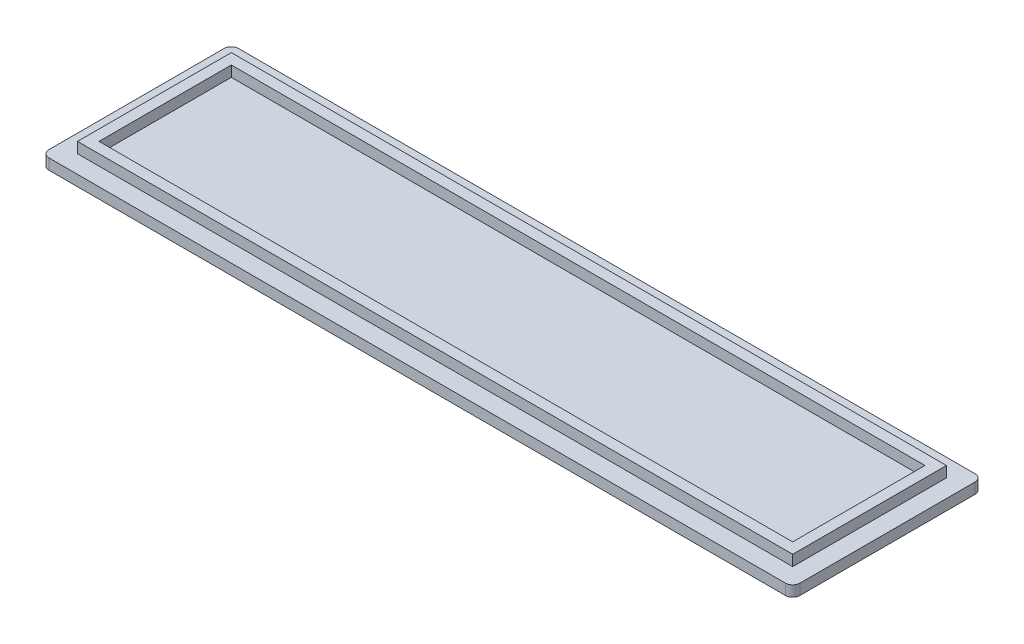
ISO-10303-21;
HEADER;
FILE_DESCRIPTION(('STEP AP214'),'2;1');
FILE_NAME('part.step','',(''),(''),'','','');
FILE_SCHEMA(('AUTOMOTIVE_DESIGN { 1 0 10303 214 1 1 1 1 }'));
ENDSEC;
DATA;
#1=APPLICATION_CONTEXT('core data for automotive mechanical design processes');
#2=APPLICATION_PROTOCOL_DEFINITION('international standard','automotive_design',2000,#1);
#3=PRODUCT_CONTEXT('',#1,'mechanical');
#4=PRODUCT('Part','Part','',(#3));
#5=PRODUCT_RELATED_PRODUCT_CATEGORY('part','',(#4));
#6=PRODUCT_DEFINITION_FORMATION('','',#4);
#7=PRODUCT_DEFINITION_CONTEXT('part definition',#1,'design');
#8=PRODUCT_DEFINITION('design','',#6,#7);
#9=PRODUCT_DEFINITION_SHAPE('','',#8);
#10=(LENGTH_UNIT() NAMED_UNIT(*) SI_UNIT(.MILLI.,.METRE.));
#11=(NAMED_UNIT(*) PLANE_ANGLE_UNIT() SI_UNIT($,.RADIAN.));
#12=(NAMED_UNIT(*) SI_UNIT($,.STERADIAN.) SOLID_ANGLE_UNIT());
#13=UNCERTAINTY_MEASURE_WITH_UNIT(LENGTH_MEASURE(1.E-05),#10,'distance_accuracy_value','');
#14=(GEOMETRIC_REPRESENTATION_CONTEXT(3) GLOBAL_UNCERTAINTY_ASSIGNED_CONTEXT((#13)) GLOBAL_UNIT_ASSIGNED_CONTEXT((#10,
#11,#12)) REPRESENTATION_CONTEXT('',''));
#15=CARTESIAN_POINT('',(0.,0.,0.));
#16=DIRECTION('',(0.,0.,1.));
#17=DIRECTION('',(1.,0.,0.));
#18=AXIS2_PLACEMENT_3D('',#15,#16,#17);
#19=CARTESIAN_POINT('',(-103.,0.,24.5));
#20=DIRECTION('',(0.,-1.,0.));
#21=DIRECTION('',(0.,0.,-1.));
#22=AXIS2_PLACEMENT_3D('',#19,#20,#21);
#23=PLANE('',#22);
#24=CARTESIAN_POINT('',(-103.,0.,24.5));
#25=DIRECTION('',(0.,-1.,0.));
#26=DIRECTION('',(0.,0.,-1.));
#27=AXIS2_PLACEMENT_3D('',#24,#25,#26);
#28=CIRCLE('',#27,2.);
#29=CARTESIAN_POINT('',(-103.,0.,26.5));
#30=VERTEX_POINT('',#29);
#31=CARTESIAN_POINT('',(-105.,0.,24.5));
#32=VERTEX_POINT('',#31);
#33=EDGE_CURVE('E361',#30,#32,#28,.T.);
#34=ORIENTED_EDGE('',*,*,#33,.F.);
#35=DIRECTION('',(-1.,0.,0.));
#36=VECTOR('',#35,1.);
#37=CARTESIAN_POINT('',(103.,0.,26.5));
#38=LINE('',#37,#36);
#39=CARTESIAN_POINT('',(103.,0.,26.5));
#40=VERTEX_POINT('',#39);
#41=EDGE_CURVE('E366',#40,#30,#38,.T.);
#42=ORIENTED_EDGE('',*,*,#41,.F.);
#43=CARTESIAN_POINT('',(103.,0.,24.5));
#44=DIRECTION('',(0.,-1.,0.));
#45=DIRECTION('',(0.,0.,-1.));
#46=AXIS2_PLACEMENT_3D('',#43,#44,#45);
#47=CIRCLE('',#46,2.);
#48=CARTESIAN_POINT('',(105.,0.,24.5));
#49=VERTEX_POINT('',#48);
#50=EDGE_CURVE('E393',#49,#40,#47,.T.);
#51=ORIENTED_EDGE('',*,*,#50,.F.);
#52=DIRECTION('',(0.,0.,1.));
#53=VECTOR('',#52,1.);
#54=CARTESIAN_POINT('',(105.,0.,-24.5));
#55=LINE('',#54,#53);
#56=CARTESIAN_POINT('',(105.,0.,-24.5));
#57=VERTEX_POINT('',#56);
#58=EDGE_CURVE('E391',#57,#49,#55,.T.);
#59=ORIENTED_EDGE('',*,*,#58,.F.);
#60=CARTESIAN_POINT('',(103.,0.,-24.5));
#61=DIRECTION('',(0.,-1.,0.));
#62=DIRECTION('',(0.,0.,-1.));
#63=AXIS2_PLACEMENT_3D('',#60,#61,#62);
#64=CIRCLE('',#63,2.);
#65=CARTESIAN_POINT('',(103.,0.,-26.5));
#66=VERTEX_POINT('',#65);
#67=EDGE_CURVE('E389',#66,#57,#64,.T.);
#68=ORIENTED_EDGE('',*,*,#67,.F.);
#69=DIRECTION('',(1.,0.,0.));
#70=VECTOR('',#69,1.);
#71=CARTESIAN_POINT('',(-103.,0.,-26.5));
#72=LINE('',#71,#70);
#73=CARTESIAN_POINT('',(-103.,0.,-26.5));
#74=VERTEX_POINT('',#73);
#75=EDGE_CURVE('E387',#74,#66,#72,.T.);
#76=ORIENTED_EDGE('',*,*,#75,.F.);
#77=CARTESIAN_POINT('',(-103.,0.,-24.5));
#78=DIRECTION('',(0.,-1.,0.));
#79=DIRECTION('',(0.,0.,-1.));
#80=AXIS2_PLACEMENT_3D('',#77,#78,#79);
#81=CIRCLE('',#80,2.);
#82=CARTESIAN_POINT('',(-105.,0.,-24.5));
#83=VERTEX_POINT('',#82);
#84=EDGE_CURVE('E385',#83,#74,#81,.T.);
#85=ORIENTED_EDGE('',*,*,#84,.F.);
#86=DIRECTION('',(0.,0.,-1.));
#87=VECTOR('',#86,1.);
#88=CARTESIAN_POINT('',(-105.,0.,24.5));
#89=LINE('',#88,#87);
#90=EDGE_CURVE('E383',#32,#83,#89,.T.);
#91=ORIENTED_EDGE('',*,*,#90,.F.);
#92=EDGE_LOOP('',(#34,#42,#51,#59,#68,#76,#85,#91));
#93=FACE_BOUND('',#92,.T.);
#94=DIRECTION('',(-1.,0.,0.));
#95=VECTOR('',#94,1.);
#96=CARTESIAN_POINT('',(-103.,0.,-21.5));
#97=LINE('',#96,#95);
#98=CARTESIAN_POINT('',(100.,0.,-21.5));
#99=VERTEX_POINT('',#98);
#100=CARTESIAN_POINT('',(-100.,0.,-21.5));
#101=VERTEX_POINT('',#100);
#102=EDGE_CURVE('E328',#99,#101,#97,.T.);
#103=ORIENTED_EDGE('',*,*,#102,.F.);
#104=DIRECTION('',(0.,0.,-1.));
#105=VECTOR('',#104,1.);
#106=CARTESIAN_POINT('',(100.,0.,24.5));
#107=LINE('',#106,#105);
#108=CARTESIAN_POINT('',(100.,0.,21.5));
#109=VERTEX_POINT('',#108);
#110=EDGE_CURVE('E333',#109,#99,#107,.T.);
#111=ORIENTED_EDGE('',*,*,#110,.F.);
#112=DIRECTION('',(1.,0.,0.));
#113=VECTOR('',#112,1.);
#114=CARTESIAN_POINT('',(-103.,0.,21.5));
#115=LINE('',#114,#113);
#116=CARTESIAN_POINT('',(-100.,0.,21.5));
#117=VERTEX_POINT('',#116);
#118=EDGE_CURVE('E345',#117,#109,#115,.T.);
#119=ORIENTED_EDGE('',*,*,#118,.F.);
#120=DIRECTION('',(0.,0.,1.));
#121=VECTOR('',#120,1.);
#122=CARTESIAN_POINT('',(-100.,0.,24.5));
#123=LINE('',#122,#121);
#124=EDGE_CURVE('E342',#101,#117,#123,.T.);
#125=ORIENTED_EDGE('',*,*,#124,.F.);
#126=EDGE_LOOP('',(#103,#111,#119,#125));
#127=FACE_BOUND('',#126,.T.);
#128=ADVANCED_FACE('F68',(#93,#127),#23,.F.);
#129=CARTESIAN_POINT('',(-103.,-3.,24.5));
#130=DIRECTION('',(0.,1.,0.));
#131=DIRECTION('',(0.,0.,1.));
#132=AXIS2_PLACEMENT_3D('',#129,#130,#131);
#133=CYLINDRICAL_SURFACE('',#132,2.);
#134=ORIENTED_EDGE('',*,*,#33,.T.);
#135=DIRECTION('',(0.,1.,0.));
#136=VECTOR('',#135,1.);
#137=CARTESIAN_POINT('',(-105.,-3.,24.5));
#138=LINE('',#137,#136);
#139=CARTESIAN_POINT('',(-105.,-3.,24.5));
#140=VERTEX_POINT('',#139);
#141=EDGE_CURVE('E12',#140,#32,#138,.T.);
#142=ORIENTED_EDGE('',*,*,#141,.F.);
#143=CARTESIAN_POINT('',(-103.,-3.,24.5));
#144=DIRECTION('',(0.,-1.,0.));
#145=DIRECTION('',(0.,0.,-1.));
#146=AXIS2_PLACEMENT_3D('',#143,#144,#145);
#147=CIRCLE('',#146,2.);
#148=CARTESIAN_POINT('',(-103.,-3.,26.5));
#149=VERTEX_POINT('',#148);
#150=EDGE_CURVE('E362',#149,#140,#147,.T.);
#151=ORIENTED_EDGE('',*,*,#150,.F.);
#152=DIRECTION('',(0.,1.,0.));
#153=VECTOR('',#152,1.);
#154=CARTESIAN_POINT('',(-103.,-3.,26.5));
#155=LINE('',#154,#153);
#156=EDGE_CURVE('E380',#149,#30,#155,.T.);
#157=ORIENTED_EDGE('',*,*,#156,.T.);
#158=EDGE_LOOP('',(#134,#142,#151,#157));
#159=FACE_BOUND('',#158,.T.);
#160=ADVANCED_FACE('F70',(#159),#133,.T.);
#161=CARTESIAN_POINT('',(-105.,-3.,24.5));
#162=DIRECTION('',(1.,0.,0.));
#163=DIRECTION('',(0.,0.,-1.));
#164=AXIS2_PLACEMENT_3D('',#161,#162,#163);
#165=PLANE('',#164);
#166=ORIENTED_EDGE('',*,*,#90,.T.);
#167=DIRECTION('',(0.,1.,0.));
#168=VECTOR('',#167,1.);
#169=CARTESIAN_POINT('',(-105.,-3.,-24.5));
#170=LINE('',#169,#168);
#171=CARTESIAN_POINT('',(-105.,-3.,-24.5));
#172=VERTEX_POINT('',#171);
#173=EDGE_CURVE('E76',#172,#83,#170,.T.);
#174=ORIENTED_EDGE('',*,*,#173,.F.);
#175=DIRECTION('',(0.,0.,-1.));
#176=VECTOR('',#175,1.);
#177=CARTESIAN_POINT('',(-105.,-3.,24.5));
#178=LINE('',#177,#176);
#179=EDGE_CURVE('E365',#140,#172,#178,.T.);
#180=ORIENTED_EDGE('',*,*,#179,.F.);
#181=ORIENTED_EDGE('',*,*,#141,.T.);
#182=EDGE_LOOP('',(#166,#174,#180,#181));
#183=FACE_BOUND('',#182,.T.);
#184=ADVANCED_FACE('F440',(#183),#165,.F.);
#185=CARTESIAN_POINT('',(-103.,-3.,-24.5));
#186=DIRECTION('',(0.,1.,0.));
#187=DIRECTION('',(0.,0.,1.));
#188=AXIS2_PLACEMENT_3D('',#185,#186,#187);
#189=CYLINDRICAL_SURFACE('',#188,2.);
#190=ORIENTED_EDGE('',*,*,#84,.T.);
#191=DIRECTION('',(0.,1.,0.));
#192=VECTOR('',#191,1.);
#193=CARTESIAN_POINT('',(-103.,-3.,-26.5));
#194=LINE('',#193,#192);
#195=CARTESIAN_POINT('',(-103.,-3.,-26.5));
#196=VERTEX_POINT('',#195);
#197=EDGE_CURVE('E410',#196,#74,#194,.T.);
#198=ORIENTED_EDGE('',*,*,#197,.F.);
#199=CARTESIAN_POINT('',(-103.,-3.,-24.5));
#200=DIRECTION('',(0.,-1.,0.));
#201=DIRECTION('',(0.,0.,-1.));
#202=AXIS2_PLACEMENT_3D('',#199,#200,#201);
#203=CIRCLE('',#202,2.);
#204=EDGE_CURVE('E368',#172,#196,#203,.T.);
#205=ORIENTED_EDGE('',*,*,#204,.F.);
#206=ORIENTED_EDGE('',*,*,#173,.T.);
#207=EDGE_LOOP('',(#190,#198,#205,#206));
#208=FACE_BOUND('',#207,.T.);
#209=ADVANCED_FACE('F417',(#208),#189,.T.);
#210=CARTESIAN_POINT('',(-103.,-3.,-26.5));
#211=DIRECTION('',(0.,0.,1.));
#212=DIRECTION('',(1.,0.,0.));
#213=AXIS2_PLACEMENT_3D('',#210,#211,#212);
#214=PLANE('',#213);
#215=ORIENTED_EDGE('',*,*,#75,.T.);
#216=DIRECTION('',(0.,1.,0.));
#217=VECTOR('',#216,1.);
#218=CARTESIAN_POINT('',(103.,-3.,-26.5));
#219=LINE('',#218,#217);
#220=CARTESIAN_POINT('',(103.,-3.,-26.5));
#221=VERTEX_POINT('',#220);
#222=EDGE_CURVE('E407',#221,#66,#219,.T.);
#223=ORIENTED_EDGE('',*,*,#222,.F.);
#224=DIRECTION('',(1.,0.,0.));
#225=VECTOR('',#224,1.);
#226=CARTESIAN_POINT('',(-103.,-3.,-26.5));
#227=LINE('',#226,#225);
#228=EDGE_CURVE('E370',#196,#221,#227,.T.);
#229=ORIENTED_EDGE('',*,*,#228,.F.);
#230=ORIENTED_EDGE('',*,*,#197,.T.);
#231=EDGE_LOOP('',(#215,#223,#229,#230));
#232=FACE_BOUND('',#231,.T.);
#233=ADVANCED_FACE('F428',(#232),#214,.F.);
#234=CARTESIAN_POINT('',(103.,-3.,-24.5));
#235=DIRECTION('',(0.,1.,0.));
#236=DIRECTION('',(0.,0.,1.));
#237=AXIS2_PLACEMENT_3D('',#234,#235,#236);
#238=CYLINDRICAL_SURFACE('',#237,2.);
#239=ORIENTED_EDGE('',*,*,#67,.T.);
#240=DIRECTION('',(0.,1.,0.));
#241=VECTOR('',#240,1.);
#242=CARTESIAN_POINT('',(105.,-3.,-24.5));
#243=LINE('',#242,#241);
#244=CARTESIAN_POINT('',(105.,-3.,-24.5));
#245=VERTEX_POINT('',#244);
#246=EDGE_CURVE('E404',#245,#57,#243,.T.);
#247=ORIENTED_EDGE('',*,*,#246,.F.);
#248=CARTESIAN_POINT('',(103.,-3.,-24.5));
#249=DIRECTION('',(0.,-1.,0.));
#250=DIRECTION('',(0.,0.,-1.));
#251=AXIS2_PLACEMENT_3D('',#248,#249,#250);
#252=CIRCLE('',#251,2.);
#253=EDGE_CURVE('E372',#221,#245,#252,.T.);
#254=ORIENTED_EDGE('',*,*,#253,.F.);
#255=ORIENTED_EDGE('',*,*,#222,.T.);
#256=EDGE_LOOP('',(#239,#247,#254,#255));
#257=FACE_BOUND('',#256,.T.);
#258=ADVANCED_FACE('F432',(#257),#238,.T.);
#259=CARTESIAN_POINT('',(105.,-3.,-24.5));
#260=DIRECTION('',(-1.,0.,0.));
#261=DIRECTION('',(0.,0.,1.));
#262=AXIS2_PLACEMENT_3D('',#259,#260,#261);
#263=PLANE('',#262);
#264=ORIENTED_EDGE('',*,*,#58,.T.);
#265=DIRECTION('',(0.,1.,0.));
#266=VECTOR('',#265,1.);
#267=CARTESIAN_POINT('',(105.,-3.,24.5));
#268=LINE('',#267,#266);
#269=CARTESIAN_POINT('',(105.,-3.,24.5));
#270=VERTEX_POINT('',#269);
#271=EDGE_CURVE('E401',#270,#49,#268,.T.);
#272=ORIENTED_EDGE('',*,*,#271,.F.);
#273=DIRECTION('',(0.,0.,1.));
#274=VECTOR('',#273,1.);
#275=CARTESIAN_POINT('',(105.,-3.,-24.5));
#276=LINE('',#275,#274);
#277=EDGE_CURVE('E374',#245,#270,#276,.T.);
#278=ORIENTED_EDGE('',*,*,#277,.F.);
#279=ORIENTED_EDGE('',*,*,#246,.T.);
#280=EDGE_LOOP('',(#264,#272,#278,#279));
#281=FACE_BOUND('',#280,.T.);
#282=ADVANCED_FACE('F453',(#281),#263,.F.);
#283=CARTESIAN_POINT('',(103.,-3.,24.5));
#284=DIRECTION('',(0.,1.,0.));
#285=DIRECTION('',(0.,0.,1.));
#286=AXIS2_PLACEMENT_3D('',#283,#284,#285);
#287=CYLINDRICAL_SURFACE('',#286,2.);
#288=ORIENTED_EDGE('',*,*,#50,.T.);
#289=DIRECTION('',(0.,1.,0.));
#290=VECTOR('',#289,1.);
#291=CARTESIAN_POINT('',(103.,-3.,26.5));
#292=LINE('',#291,#290);
#293=CARTESIAN_POINT('',(103.,-3.,26.5));
#294=VERTEX_POINT('',#293);
#295=EDGE_CURVE('E398',#294,#40,#292,.T.);
#296=ORIENTED_EDGE('',*,*,#295,.F.);
#297=CARTESIAN_POINT('',(103.,-3.,24.5));
#298=DIRECTION('',(0.,-1.,0.));
#299=DIRECTION('',(0.,0.,-1.));
#300=AXIS2_PLACEMENT_3D('',#297,#298,#299);
#301=CIRCLE('',#300,2.);
#302=EDGE_CURVE('E376',#270,#294,#301,.T.);
#303=ORIENTED_EDGE('',*,*,#302,.F.);
#304=ORIENTED_EDGE('',*,*,#271,.T.);
#305=EDGE_LOOP('',(#288,#296,#303,#304));
#306=FACE_BOUND('',#305,.T.);
#307=ADVANCED_FACE('F451',(#306),#287,.T.);
#308=CARTESIAN_POINT('',(103.,-3.,26.5));
#309=DIRECTION('',(0.,0.,-1.));
#310=DIRECTION('',(-1.,0.,0.));
#311=AXIS2_PLACEMENT_3D('',#308,#309,#310);
#312=PLANE('',#311);
#313=ORIENTED_EDGE('',*,*,#41,.T.);
#314=ORIENTED_EDGE('',*,*,#156,.F.);
#315=DIRECTION('',(-1.,0.,0.));
#316=VECTOR('',#315,1.);
#317=CARTESIAN_POINT('',(103.,-3.,26.5));
#318=LINE('',#317,#316);
#319=EDGE_CURVE('E378',#294,#149,#318,.T.);
#320=ORIENTED_EDGE('',*,*,#319,.F.);
#321=ORIENTED_EDGE('',*,*,#295,.T.);
#322=EDGE_LOOP('',(#313,#314,#320,#321));
#323=FACE_BOUND('',#322,.T.);
#324=ADVANCED_FACE('F446',(#323),#312,.F.);
#325=CARTESIAN_POINT('',(-103.,-3.,24.5));
#326=DIRECTION('',(0.,-1.,0.));
#327=DIRECTION('',(0.,0.,-1.));
#328=AXIS2_PLACEMENT_3D('',#325,#326,#327);
#329=PLANE('',#328);
#330=DIRECTION('',(0.,0.,1.));
#331=VECTOR('',#330,1.);
#332=CARTESIAN_POINT('',(12.55,-3.,15.8));
#333=LINE('',#332,#331);
#334=CARTESIAN_POINT('',(12.55,-3.,15.8));
#335=VERTEX_POINT('',#334);
#336=CARTESIAN_POINT('',(12.55,-3.,18.));
#337=VERTEX_POINT('',#336);
#338=EDGE_CURVE('E83',#335,#337,#333,.T.);
#339=ORIENTED_EDGE('',*,*,#338,.F.);
#340=DIRECTION('',(1.,0.,0.));
#341=VECTOR('',#340,1.);
#342=CARTESIAN_POINT('',(8.45000000000001,-3.,15.8));
#343=LINE('',#342,#341);
#344=CARTESIAN_POINT('',(8.45000000000001,-3.,15.8));
#345=VERTEX_POINT('',#344);
#346=EDGE_CURVE('E250',#345,#335,#343,.T.);
#347=ORIENTED_EDGE('',*,*,#346,.F.);
#348=DIRECTION('',(0.,0.,-1.));
#349=VECTOR('',#348,1.);
#350=CARTESIAN_POINT('',(8.45000000000001,-3.,15.8));
#351=LINE('',#350,#349);
#352=CARTESIAN_POINT('',(8.45000000000001,-3.,18.));
#353=VERTEX_POINT('',#352);
#354=EDGE_CURVE('E253',#353,#345,#351,.T.);
#355=ORIENTED_EDGE('',*,*,#354,.F.);
#356=DIRECTION('',(-1.,0.,0.));
#357=VECTOR('',#356,1.);
#358=CARTESIAN_POINT('',(8.45000000000001,-3.,18.));
#359=LINE('',#358,#357);
#360=EDGE_CURVE('E259',#337,#353,#359,.T.);
#361=ORIENTED_EDGE('',*,*,#360,.F.);
#362=EDGE_LOOP('',(#339,#347,#355,#361));
#363=FACE_BOUND('',#362,.T.);
#364=DIRECTION('',(0.,0.,1.));
#365=VECTOR('',#364,1.);
#366=CARTESIAN_POINT('',(20.55,-3.,15.8));
#367=LINE('',#366,#365);
#368=CARTESIAN_POINT('',(20.55,-3.,15.8));
#369=VERTEX_POINT('',#368);
#370=CARTESIAN_POINT('',(20.55,-3.,18.));
#371=VERTEX_POINT('',#370);
#372=EDGE_CURVE('E91',#369,#371,#367,.T.);
#373=ORIENTED_EDGE('',*,*,#372,.F.);
#374=DIRECTION('',(1.,0.,0.));
#375=VECTOR('',#374,1.);
#376=CARTESIAN_POINT('',(20.55,-3.,15.8));
#377=LINE('',#376,#375);
#378=CARTESIAN_POINT('',(16.45,-3.,15.8));
#379=VERTEX_POINT('',#378);
#380=EDGE_CURVE('E278',#379,#369,#377,.T.);
#381=ORIENTED_EDGE('',*,*,#380,.F.);
#382=DIRECTION('',(0.,0.,-1.));
#383=VECTOR('',#382,1.);
#384=CARTESIAN_POINT('',(16.45,-3.,15.8));
#385=LINE('',#384,#383);
#386=CARTESIAN_POINT('',(16.45,-3.,18.));
#387=VERTEX_POINT('',#386);
#388=EDGE_CURVE('E281',#387,#379,#385,.T.);
#389=ORIENTED_EDGE('',*,*,#388,.F.);
#390=DIRECTION('',(-1.,0.,0.));
#391=VECTOR('',#390,1.);
#392=CARTESIAN_POINT('',(20.55,-3.,18.));
#393=LINE('',#392,#391);
#394=EDGE_CURVE('E285',#371,#387,#393,.T.);
#395=ORIENTED_EDGE('',*,*,#394,.F.);
#396=EDGE_LOOP('',(#373,#381,#389,#395));
#397=FACE_BOUND('',#396,.T.);
#398=ORIENTED_EDGE('',*,*,#150,.T.);
#399=ORIENTED_EDGE('',*,*,#179,.T.);
#400=ORIENTED_EDGE('',*,*,#204,.T.);
#401=ORIENTED_EDGE('',*,*,#228,.T.);
#402=ORIENTED_EDGE('',*,*,#253,.T.);
#403=ORIENTED_EDGE('',*,*,#277,.T.);
#404=ORIENTED_EDGE('',*,*,#302,.T.);
#405=ORIENTED_EDGE('',*,*,#319,.T.);
#406=EDGE_LOOP('',(#398,#399,#400,#401,#402,#403,#404,#405));
#407=FACE_BOUND('',#406,.T.);
#408=ADVANCED_FACE('F436',(#363,#397,#407),#329,.T.);
#409=CARTESIAN_POINT('',(0.,3.,0.));
#410=DIRECTION('',(0.,1.,0.));
#411=DIRECTION('',(0.,0.,1.));
#412=AXIS2_PLACEMENT_3D('',#409,#410,#411);
#413=PLANE('',#412);
#414=DIRECTION('',(-1.,0.,0.));
#415=VECTOR('',#414,1.);
#416=CARTESIAN_POINT('',(-103.,3.,-21.5));
#417=LINE('',#416,#415);
#418=CARTESIAN_POINT('',(100.,3.,-21.5));
#419=VERTEX_POINT('',#418);
#420=CARTESIAN_POINT('',(-100.,3.,-21.5));
#421=VERTEX_POINT('',#420);
#422=EDGE_CURVE('E329',#419,#421,#417,.T.);
#423=ORIENTED_EDGE('',*,*,#422,.T.);
#424=DIRECTION('',(0.,0.,1.));
#425=VECTOR('',#424,1.);
#426=CARTESIAN_POINT('',(-100.,3.,24.5));
#427=LINE('',#426,#425);
#428=CARTESIAN_POINT('',(-100.,3.,21.5));
#429=VERTEX_POINT('',#428);
#430=EDGE_CURVE('E332',#421,#429,#427,.T.);
#431=ORIENTED_EDGE('',*,*,#430,.T.);
#432=DIRECTION('',(1.,0.,0.));
#433=VECTOR('',#432,1.);
#434=CARTESIAN_POINT('',(-103.,3.,21.5));
#435=LINE('',#434,#433);
#436=CARTESIAN_POINT('',(100.,3.,21.5));
#437=VERTEX_POINT('',#436);
#438=EDGE_CURVE('E335',#429,#437,#435,.T.);
#439=ORIENTED_EDGE('',*,*,#438,.T.);
#440=DIRECTION('',(0.,0.,-1.));
#441=VECTOR('',#440,1.);
#442=CARTESIAN_POINT('',(100.,3.,24.5));
#443=LINE('',#442,#441);
#444=EDGE_CURVE('E337',#437,#419,#443,.T.);
#445=ORIENTED_EDGE('',*,*,#444,.T.);
#446=EDGE_LOOP('',(#423,#431,#439,#445));
#447=FACE_BOUND('',#446,.T.);
#448=DIRECTION('',(0.,0.,1.));
#449=VECTOR('',#448,1.);
#450=CARTESIAN_POINT('',(-97.,3.,24.5));
#451=LINE('',#450,#449);
#452=CARTESIAN_POINT('',(-97.,3.,-18.5));
#453=VERTEX_POINT('',#452);
#454=CARTESIAN_POINT('',(-97.,3.,18.5));
#455=VERTEX_POINT('',#454);
#456=EDGE_CURVE('E301',#453,#455,#451,.T.);
#457=ORIENTED_EDGE('',*,*,#456,.F.);
#458=DIRECTION('',(-1.,0.,0.));
#459=VECTOR('',#458,1.);
#460=CARTESIAN_POINT('',(-103.,3.,-18.5));
#461=LINE('',#460,#459);
#462=CARTESIAN_POINT('',(97.,3.,-18.5));
#463=VERTEX_POINT('',#462);
#464=EDGE_CURVE('E299',#463,#453,#461,.T.);
#465=ORIENTED_EDGE('',*,*,#464,.F.);
#466=DIRECTION('',(0.,0.,-1.));
#467=VECTOR('',#466,1.);
#468=CARTESIAN_POINT('',(97.,3.,24.5));
#469=LINE('',#468,#467);
#470=CARTESIAN_POINT('',(97.,3.,18.5));
#471=VERTEX_POINT('',#470);
#472=EDGE_CURVE('E307',#471,#463,#469,.T.);
#473=ORIENTED_EDGE('',*,*,#472,.F.);
#474=DIRECTION('',(1.,0.,0.));
#475=VECTOR('',#474,1.);
#476=CARTESIAN_POINT('',(-103.,3.,18.5));
#477=LINE('',#476,#475);
#478=EDGE_CURVE('E304',#455,#471,#477,.T.);
#479=ORIENTED_EDGE('',*,*,#478,.F.);
#480=EDGE_LOOP('',(#457,#465,#473,#479));
#481=FACE_BOUND('',#480,.T.);
#482=ADVANCED_FACE('F502',(#447,#481),#413,.T.);
#483=CARTESIAN_POINT('',(-103.,3.,-21.5));
#484=DIRECTION('',(0.,0.,1.));
#485=DIRECTION('',(1.,0.,0.));
#486=AXIS2_PLACEMENT_3D('',#483,#484,#485);
#487=PLANE('',#486);
#488=ORIENTED_EDGE('',*,*,#102,.T.);
#489=DIRECTION('',(0.,-1.,0.));
#490=VECTOR('',#489,1.);
#491=CARTESIAN_POINT('',(-100.,3.,-21.5));
#492=LINE('',#491,#490);
#493=EDGE_CURVE('E358',#421,#101,#492,.T.);
#494=ORIENTED_EDGE('',*,*,#493,.F.);
#495=ORIENTED_EDGE('',*,*,#422,.F.);
#496=DIRECTION('',(0.,-1.,0.));
#497=VECTOR('',#496,1.);
#498=CARTESIAN_POINT('',(100.,3.,-21.5));
#499=LINE('',#498,#497);
#500=EDGE_CURVE('E339',#419,#99,#499,.T.);
#501=ORIENTED_EDGE('',*,*,#500,.T.);
#502=EDGE_LOOP('',(#488,#494,#495,#501));
#503=FACE_BOUND('',#502,.T.);
#504=ADVANCED_FACE('F504',(#503),#487,.F.);
#505=CARTESIAN_POINT('',(-100.,3.,24.5));
#506=DIRECTION('',(1.,0.,0.));
#507=DIRECTION('',(0.,0.,-1.));
#508=AXIS2_PLACEMENT_3D('',#505,#506,#507);
#509=PLANE('',#508);
#510=ORIENTED_EDGE('',*,*,#124,.T.);
#511=DIRECTION('',(0.,-1.,0.));
#512=VECTOR('',#511,1.);
#513=CARTESIAN_POINT('',(-100.,3.,21.5));
#514=LINE('',#513,#512);
#515=EDGE_CURVE('E355',#429,#117,#514,.T.);
#516=ORIENTED_EDGE('',*,*,#515,.F.);
#517=ORIENTED_EDGE('',*,*,#430,.F.);
#518=ORIENTED_EDGE('',*,*,#493,.T.);
#519=EDGE_LOOP('',(#510,#516,#517,#518));
#520=FACE_BOUND('',#519,.T.);
#521=ADVANCED_FACE('F512',(#520),#509,.F.);
#522=CARTESIAN_POINT('',(-103.,3.,21.5));
#523=DIRECTION('',(0.,0.,-1.));
#524=DIRECTION('',(-1.,0.,0.));
#525=AXIS2_PLACEMENT_3D('',#522,#523,#524);
#526=PLANE('',#525);
#527=ORIENTED_EDGE('',*,*,#118,.T.);
#528=DIRECTION('',(0.,-1.,0.));
#529=VECTOR('',#528,1.);
#530=CARTESIAN_POINT('',(100.,3.,21.5));
#531=LINE('',#530,#529);
#532=EDGE_CURVE('E352',#437,#109,#531,.T.);
#533=ORIENTED_EDGE('',*,*,#532,.F.);
#534=ORIENTED_EDGE('',*,*,#438,.F.);
#535=ORIENTED_EDGE('',*,*,#515,.T.);
#536=EDGE_LOOP('',(#527,#533,#534,#535));
#537=FACE_BOUND('',#536,.T.);
#538=ADVANCED_FACE('F508',(#537),#526,.F.);
#539=CARTESIAN_POINT('',(100.,3.,24.5));
#540=DIRECTION('',(-1.,0.,0.));
#541=DIRECTION('',(0.,0.,1.));
#542=AXIS2_PLACEMENT_3D('',#539,#540,#541);
#543=PLANE('',#542);
#544=ORIENTED_EDGE('',*,*,#110,.T.);
#545=ORIENTED_EDGE('',*,*,#500,.F.);
#546=ORIENTED_EDGE('',*,*,#444,.F.);
#547=ORIENTED_EDGE('',*,*,#532,.T.);
#548=EDGE_LOOP('',(#544,#545,#546,#547));
#549=FACE_BOUND('',#548,.T.);
#550=ADVANCED_FACE('F500',(#549),#543,.F.);
#551=CARTESIAN_POINT('',(-103.,3.,-18.5));
#552=DIRECTION('',(0.,0.,1.));
#553=DIRECTION('',(1.,0.,0.));
#554=AXIS2_PLACEMENT_3D('',#551,#552,#553);
#555=PLANE('',#554);
#556=DIRECTION('',(-1.,0.,0.));
#557=VECTOR('',#556,1.);
#558=CARTESIAN_POINT('',(-103.,0.,-18.5));
#559=LINE('',#558,#557);
#560=CARTESIAN_POINT('',(97.,0.,-18.5));
#561=VERTEX_POINT('',#560);
#562=CARTESIAN_POINT('',(-97.,0.,-18.5));
#563=VERTEX_POINT('',#562);
#564=EDGE_CURVE('E265',#561,#563,#559,.T.);
#565=ORIENTED_EDGE('',*,*,#564,.F.);
#566=DIRECTION('',(0.,-1.,0.));
#567=VECTOR('',#566,1.);
#568=CARTESIAN_POINT('',(97.,3.,-18.5));
#569=LINE('',#568,#567);
#570=EDGE_CURVE('E309',#463,#561,#569,.T.);
#571=ORIENTED_EDGE('',*,*,#570,.F.);
#572=ORIENTED_EDGE('',*,*,#464,.T.);
#573=DIRECTION('',(0.,-1.,0.));
#574=VECTOR('',#573,1.);
#575=CARTESIAN_POINT('',(-97.,3.,-18.5));
#576=LINE('',#575,#574);
#577=EDGE_CURVE('E325',#453,#563,#576,.T.);
#578=ORIENTED_EDGE('',*,*,#577,.T.);
#579=EDGE_LOOP('',(#565,#571,#572,#578));
#580=FACE_BOUND('',#579,.T.);
#581=ADVANCED_FACE('F496',(#580),#555,.T.);
#582=CARTESIAN_POINT('',(-97.,3.,24.5));
#583=DIRECTION('',(1.,0.,0.));
#584=DIRECTION('',(0.,0.,-1.));
#585=AXIS2_PLACEMENT_3D('',#582,#583,#584);
#586=PLANE('',#585);
#587=DIRECTION('',(0.,0.,1.));
#588=VECTOR('',#587,1.);
#589=CARTESIAN_POINT('',(-97.,0.,24.5));
#590=LINE('',#589,#588);
#591=CARTESIAN_POINT('',(-97.,0.,18.5));
#592=VERTEX_POINT('',#591);
#593=EDGE_CURVE('E312',#563,#592,#590,.T.);
#594=ORIENTED_EDGE('',*,*,#593,.F.);
#595=ORIENTED_EDGE('',*,*,#577,.F.);
#596=ORIENTED_EDGE('',*,*,#456,.T.);
#597=DIRECTION('',(0.,-1.,0.));
#598=VECTOR('',#597,1.);
#599=CARTESIAN_POINT('',(-97.,3.,18.5));
#600=LINE('',#599,#598);
#601=EDGE_CURVE('E323',#455,#592,#600,.T.);
#602=ORIENTED_EDGE('',*,*,#601,.T.);
#603=EDGE_LOOP('',(#594,#595,#596,#602));
#604=FACE_BOUND('',#603,.T.);
#605=ADVANCED_FACE('F487',(#604),#586,.T.);
#606=CARTESIAN_POINT('',(-103.,3.,18.5));
#607=DIRECTION('',(0.,0.,-1.));
#608=DIRECTION('',(-1.,0.,0.));
#609=AXIS2_PLACEMENT_3D('',#606,#607,#608);
#610=PLANE('',#609);
#611=DIRECTION('',(1.,0.,0.));
#612=VECTOR('',#611,1.);
#613=CARTESIAN_POINT('',(-103.,0.,18.5));
#614=LINE('',#613,#612);
#615=CARTESIAN_POINT('',(97.,0.,18.5));
#616=VERTEX_POINT('',#615);
#617=EDGE_CURVE('E315',#592,#616,#614,.T.);
#618=ORIENTED_EDGE('',*,*,#617,.F.);
#619=ORIENTED_EDGE('',*,*,#601,.F.);
#620=ORIENTED_EDGE('',*,*,#478,.T.);
#621=DIRECTION('',(0.,-1.,0.));
#622=VECTOR('',#621,1.);
#623=CARTESIAN_POINT('',(97.,3.,18.5));
#624=LINE('',#623,#622);
#625=EDGE_CURVE('E321',#471,#616,#624,.T.);
#626=ORIENTED_EDGE('',*,*,#625,.T.);
#627=EDGE_LOOP('',(#618,#619,#620,#626));
#628=FACE_BOUND('',#627,.T.);
#629=ADVANCED_FACE('F481',(#628),#610,.T.);
#630=CARTESIAN_POINT('',(97.,3.,24.5));
#631=DIRECTION('',(-1.,0.,0.));
#632=DIRECTION('',(0.,0.,1.));
#633=AXIS2_PLACEMENT_3D('',#630,#631,#632);
#634=PLANE('',#633);
#635=DIRECTION('',(0.,0.,-1.));
#636=VECTOR('',#635,1.);
#637=CARTESIAN_POINT('',(97.,0.,24.5));
#638=LINE('',#637,#636);
#639=EDGE_CURVE('E302',#616,#561,#638,.T.);
#640=ORIENTED_EDGE('',*,*,#639,.F.);
#641=ORIENTED_EDGE('',*,*,#625,.F.);
#642=ORIENTED_EDGE('',*,*,#472,.T.);
#643=ORIENTED_EDGE('',*,*,#570,.T.);
#644=EDGE_LOOP('',(#640,#641,#642,#643));
#645=FACE_BOUND('',#644,.T.);
#646=ADVANCED_FACE('F473',(#645),#634,.T.);
#647=DIRECTION('',(1.,0.,0.));
#648=VECTOR('',#647,1.);
#649=CARTESIAN_POINT('',(8.45000000000001,0.,15.8));
#650=LINE('',#649,#648);
#651=CARTESIAN_POINT('',(8.45000000000001,0.,15.8));
#652=VERTEX_POINT('',#651);
#653=CARTESIAN_POINT('',(12.55,0.,15.8));
#654=VERTEX_POINT('',#653);
#655=EDGE_CURVE('E237',#652,#654,#650,.T.);
#656=ORIENTED_EDGE('',*,*,#655,.T.);
#657=DIRECTION('',(0.,0.,1.));
#658=VECTOR('',#657,1.);
#659=CARTESIAN_POINT('',(12.55,0.,15.8));
#660=LINE('',#659,#658);
#661=CARTESIAN_POINT('',(12.55,0.,18.));
#662=VERTEX_POINT('',#661);
#663=EDGE_CURVE('E231',#654,#662,#660,.T.);
#664=ORIENTED_EDGE('',*,*,#663,.T.);
#665=DIRECTION('',(-1.,0.,0.));
#666=VECTOR('',#665,1.);
#667=CARTESIAN_POINT('',(8.45000000000001,0.,18.));
#668=LINE('',#667,#666);
#669=CARTESIAN_POINT('',(8.45000000000001,0.,18.));
#670=VERTEX_POINT('',#669);
#671=EDGE_CURVE('E241',#662,#670,#668,.T.);
#672=ORIENTED_EDGE('',*,*,#671,.T.);
#673=DIRECTION('',(0.,0.,-1.));
#674=VECTOR('',#673,1.);
#675=CARTESIAN_POINT('',(8.45000000000001,0.,15.8));
#676=LINE('',#675,#674);
#677=EDGE_CURVE('E245',#670,#652,#676,.T.);
#678=ORIENTED_EDGE('',*,*,#677,.T.);
#679=EDGE_LOOP('',(#656,#664,#672,#678));
#680=FACE_BOUND('',#679,.T.);
#681=DIRECTION('',(1.,0.,0.));
#682=VECTOR('',#681,1.);
#683=CARTESIAN_POINT('',(20.55,0.,15.8));
#684=LINE('',#683,#682);
#685=CARTESIAN_POINT('',(16.45,0.,15.8));
#686=VERTEX_POINT('',#685);
#687=CARTESIAN_POINT('',(20.55,0.,15.8));
#688=VERTEX_POINT('',#687);
#689=EDGE_CURVE('E271',#686,#688,#684,.T.);
#690=ORIENTED_EDGE('',*,*,#689,.T.);
#691=DIRECTION('',(0.,0.,1.));
#692=VECTOR('',#691,1.);
#693=CARTESIAN_POINT('',(20.55,0.,15.8));
#694=LINE('',#693,#692);
#695=CARTESIAN_POINT('',(20.55,0.,18.));
#696=VERTEX_POINT('',#695);
#697=EDGE_CURVE('E282',#688,#696,#694,.T.);
#698=ORIENTED_EDGE('',*,*,#697,.T.);
#699=DIRECTION('',(-1.,0.,0.));
#700=VECTOR('',#699,1.);
#701=CARTESIAN_POINT('',(20.55,0.,18.));
#702=LINE('',#701,#700);
#703=CARTESIAN_POINT('',(16.45,0.,18.));
#704=VERTEX_POINT('',#703);
#705=EDGE_CURVE('E294',#696,#704,#702,.T.);
#706=ORIENTED_EDGE('',*,*,#705,.T.);
#707=DIRECTION('',(0.,0.,-1.));
#708=VECTOR('',#707,1.);
#709=CARTESIAN_POINT('',(16.45,0.,15.8));
#710=LINE('',#709,#708);
#711=EDGE_CURVE('E291',#704,#686,#710,.T.);
#712=ORIENTED_EDGE('',*,*,#711,.T.);
#713=EDGE_LOOP('',(#690,#698,#706,#712));
#714=FACE_BOUND('',#713,.T.);
#715=ORIENTED_EDGE('',*,*,#639,.T.);
#716=ORIENTED_EDGE('',*,*,#564,.T.);
#717=ORIENTED_EDGE('',*,*,#593,.T.);
#718=ORIENTED_EDGE('',*,*,#617,.T.);
#719=EDGE_LOOP('',(#715,#716,#717,#718));
#720=FACE_BOUND('',#719,.T.);
#721=ADVANCED_FACE('F247',(#680,#714,#720),#23,.F.);
#722=CARTESIAN_POINT('',(20.55,0.,15.8));
#723=DIRECTION('',(1.,0.,0.));
#724=DIRECTION('',(0.,0.,-1.));
#725=AXIS2_PLACEMENT_3D('',#722,#723,#724);
#726=PLANE('',#725);
#727=ORIENTED_EDGE('',*,*,#372,.T.);
#728=DIRECTION('',(0.,-1.,0.));
#729=VECTOR('',#728,1.);
#730=CARTESIAN_POINT('',(20.55,0.,18.));
#731=LINE('',#730,#729);
#732=EDGE_CURVE('E269',#696,#371,#731,.T.);
#733=ORIENTED_EDGE('',*,*,#732,.F.);
#734=ORIENTED_EDGE('',*,*,#697,.F.);
#735=DIRECTION('',(0.,-1.,0.));
#736=VECTOR('',#735,1.);
#737=CARTESIAN_POINT('',(20.55,0.,15.8));
#738=LINE('',#737,#736);
#739=EDGE_CURVE('E276',#688,#369,#738,.T.);
#740=ORIENTED_EDGE('',*,*,#739,.T.);
#741=EDGE_LOOP('',(#727,#733,#734,#740));
#742=FACE_BOUND('',#741,.T.);
#743=ADVANCED_FACE('F472',(#742),#726,.F.);
#744=CARTESIAN_POINT('',(20.55,0.,15.8));
#745=DIRECTION('',(0.,0.,-1.));
#746=DIRECTION('',(-1.,0.,0.));
#747=AXIS2_PLACEMENT_3D('',#744,#745,#746);
#748=PLANE('',#747);
#749=ORIENTED_EDGE('',*,*,#380,.T.);
#750=ORIENTED_EDGE('',*,*,#739,.F.);
#751=ORIENTED_EDGE('',*,*,#689,.F.);
#752=DIRECTION('',(0.,-1.,0.));
#753=VECTOR('',#752,1.);
#754=CARTESIAN_POINT('',(16.45,0.,15.8));
#755=LINE('',#754,#753);
#756=EDGE_CURVE('E274',#686,#379,#755,.T.);
#757=ORIENTED_EDGE('',*,*,#756,.T.);
#758=EDGE_LOOP('',(#749,#750,#751,#757));
#759=FACE_BOUND('',#758,.T.);
#760=ADVANCED_FACE('F478',(#759),#748,.F.);
#761=CARTESIAN_POINT('',(16.45,0.,15.8));
#762=DIRECTION('',(-1.,0.,0.));
#763=DIRECTION('',(0.,0.,1.));
#764=AXIS2_PLACEMENT_3D('',#761,#762,#763);
#765=PLANE('',#764);
#766=ORIENTED_EDGE('',*,*,#388,.T.);
#767=ORIENTED_EDGE('',*,*,#756,.F.);
#768=ORIENTED_EDGE('',*,*,#711,.F.);
#769=DIRECTION('',(0.,-1.,0.));
#770=VECTOR('',#769,1.);
#771=CARTESIAN_POINT('',(16.45,0.,18.));
#772=LINE('',#771,#770);
#773=EDGE_CURVE('E272',#704,#387,#772,.T.);
#774=ORIENTED_EDGE('',*,*,#773,.T.);
#775=EDGE_LOOP('',(#766,#767,#768,#774));
#776=FACE_BOUND('',#775,.T.);
#777=ADVANCED_FACE('F536',(#776),#765,.F.);
#778=CARTESIAN_POINT('',(20.55,0.,18.));
#779=DIRECTION('',(0.,0.,1.));
#780=DIRECTION('',(1.,0.,0.));
#781=AXIS2_PLACEMENT_3D('',#778,#779,#780);
#782=PLANE('',#781);
#783=ORIENTED_EDGE('',*,*,#394,.T.);
#784=ORIENTED_EDGE('',*,*,#773,.F.);
#785=ORIENTED_EDGE('',*,*,#705,.F.);
#786=ORIENTED_EDGE('',*,*,#732,.T.);
#787=EDGE_LOOP('',(#783,#784,#785,#786));
#788=FACE_BOUND('',#787,.T.);
#789=ADVANCED_FACE('F529',(#788),#782,.F.);
#790=CARTESIAN_POINT('',(12.55,0.,15.8));
#791=DIRECTION('',(1.,0.,0.));
#792=DIRECTION('',(0.,0.,-1.));
#793=AXIS2_PLACEMENT_3D('',#790,#791,#792);
#794=PLANE('',#793);
#795=ORIENTED_EDGE('',*,*,#338,.T.);
#796=DIRECTION('',(0.,-1.,0.));
#797=VECTOR('',#796,1.);
#798=CARTESIAN_POINT('',(12.55,0.,18.));
#799=LINE('',#798,#797);
#800=EDGE_CURVE('E227',#662,#337,#799,.T.);
#801=ORIENTED_EDGE('',*,*,#800,.F.);
#802=ORIENTED_EDGE('',*,*,#663,.F.);
#803=DIRECTION('',(0.,-1.,0.));
#804=VECTOR('',#803,1.);
#805=CARTESIAN_POINT('',(12.55,0.,15.8));
#806=LINE('',#805,#804);
#807=EDGE_CURVE('E263',#654,#335,#806,.T.);
#808=ORIENTED_EDGE('',*,*,#807,.T.);
#809=EDGE_LOOP('',(#795,#801,#802,#808));
#810=FACE_BOUND('',#809,.T.);
#811=ADVANCED_FACE('F229',(#810),#794,.F.);
#812=CARTESIAN_POINT('',(8.45000000000001,0.,15.8));
#813=DIRECTION('',(0.,0.,-1.));
#814=DIRECTION('',(-1.,0.,0.));
#815=AXIS2_PLACEMENT_3D('',#812,#813,#814);
#816=PLANE('',#815);
#817=ORIENTED_EDGE('',*,*,#346,.T.);
#818=ORIENTED_EDGE('',*,*,#807,.F.);
#819=ORIENTED_EDGE('',*,*,#655,.F.);
#820=DIRECTION('',(0.,-1.,0.));
#821=VECTOR('',#820,1.);
#822=CARTESIAN_POINT('',(8.45000000000001,0.,15.8));
#823=LINE('',#822,#821);
#824=EDGE_CURVE('E266',#652,#345,#823,.T.);
#825=ORIENTED_EDGE('',*,*,#824,.T.);
#826=EDGE_LOOP('',(#817,#818,#819,#825));
#827=FACE_BOUND('',#826,.T.);
#828=ADVANCED_FACE('F546',(#827),#816,.F.);
#829=CARTESIAN_POINT('',(8.45000000000001,0.,15.8));
#830=DIRECTION('',(-1.,0.,0.));
#831=DIRECTION('',(0.,0.,1.));
#832=AXIS2_PLACEMENT_3D('',#829,#830,#831);
#833=PLANE('',#832);
#834=ORIENTED_EDGE('',*,*,#354,.T.);
#835=ORIENTED_EDGE('',*,*,#824,.F.);
#836=ORIENTED_EDGE('',*,*,#677,.F.);
#837=DIRECTION('',(0.,-1.,0.));
#838=VECTOR('',#837,1.);
#839=CARTESIAN_POINT('',(8.45000000000001,0.,18.));
#840=LINE('',#839,#838);
#841=EDGE_CURVE('E236',#670,#353,#840,.T.);
#842=ORIENTED_EDGE('',*,*,#841,.T.);
#843=EDGE_LOOP('',(#834,#835,#836,#842));
#844=FACE_BOUND('',#843,.T.);
#845=ADVANCED_FACE('F549',(#844),#833,.F.);
#846=CARTESIAN_POINT('',(8.45000000000001,0.,18.));
#847=DIRECTION('',(0.,0.,1.));
#848=DIRECTION('',(1.,0.,0.));
#849=AXIS2_PLACEMENT_3D('',#846,#847,#848);
#850=PLANE('',#849);
#851=ORIENTED_EDGE('',*,*,#360,.T.);
#852=ORIENTED_EDGE('',*,*,#841,.F.);
#853=ORIENTED_EDGE('',*,*,#671,.F.);
#854=ORIENTED_EDGE('',*,*,#800,.T.);
#855=EDGE_LOOP('',(#851,#852,#853,#854));
#856=FACE_BOUND('',#855,.T.);
#857=ADVANCED_FACE('F242',(#856),#850,.F.);
#858=CLOSED_SHELL('',(#128,#160,#184,#209,#233,#258,#282,#307,#324,#408,#482,#504,#521,#538,
#550,#581,#605,#629,#646,#721,#743,#760,#777,#789,#811,#828,#845,#857));
#859=MANIFOLD_SOLID_BREP('B2',#858);
#860=ADVANCED_BREP_SHAPE_REPRESENTATION('',(#18,#859),#14);
#861=SHAPE_DEFINITION_REPRESENTATION(#9,#860);
ENDSEC;
END-ISO-10303-21;
